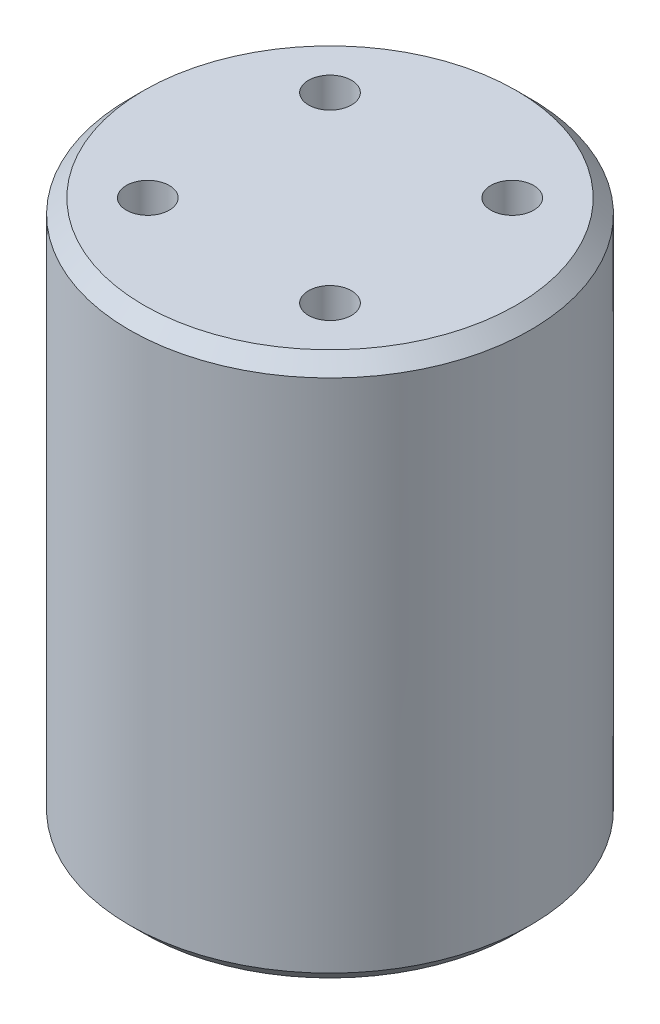
ISO-10303-21;
HEADER;
FILE_DESCRIPTION(('STEP AP214'),'2;1');
FILE_NAME('part.step','',(''),(''),'','','');
FILE_SCHEMA(('AUTOMOTIVE_DESIGN { 1 0 10303 214 1 1 1 1 }'));
ENDSEC;
DATA;
#1=APPLICATION_CONTEXT('core data for automotive mechanical design processes');
#2=APPLICATION_PROTOCOL_DEFINITION('international standard','automotive_design',2000,#1);
#3=PRODUCT_CONTEXT('',#1,'mechanical');
#4=PRODUCT('Part','Part','',(#3));
#5=PRODUCT_RELATED_PRODUCT_CATEGORY('part','',(#4));
#6=PRODUCT_DEFINITION_FORMATION('','',#4);
#7=PRODUCT_DEFINITION_CONTEXT('part definition',#1,'design');
#8=PRODUCT_DEFINITION('design','',#6,#7);
#9=PRODUCT_DEFINITION_SHAPE('','',#8);
#10=(LENGTH_UNIT() NAMED_UNIT(*) SI_UNIT(.MILLI.,.METRE.));
#11=(NAMED_UNIT(*) PLANE_ANGLE_UNIT() SI_UNIT($,.RADIAN.));
#12=(NAMED_UNIT(*) SI_UNIT($,.STERADIAN.) SOLID_ANGLE_UNIT());
#13=UNCERTAINTY_MEASURE_WITH_UNIT(LENGTH_MEASURE(1.E-05),#10,'distance_accuracy_value','');
#14=(GEOMETRIC_REPRESENTATION_CONTEXT(3) GLOBAL_UNCERTAINTY_ASSIGNED_CONTEXT((#13)) GLOBAL_UNIT_ASSIGNED_CONTEXT((#10,
#11,#12)) REPRESENTATION_CONTEXT('',''));
#15=CARTESIAN_POINT('',(0.,0.,0.));
#16=DIRECTION('',(0.,0.,1.));
#17=DIRECTION('',(1.,0.,0.));
#18=AXIS2_PLACEMENT_3D('',#15,#16,#17);
#19=CARTESIAN_POINT('',(0.,-10.,0.));
#20=DIRECTION('',(0.,1.,0.));
#21=DIRECTION('',(0.,0.,1.));
#22=AXIS2_PLACEMENT_3D('',#19,#20,#21);
#23=CYLINDRICAL_SURFACE('',#22,14.);
#24=CARTESIAN_POINT('',(0.,27.,0.));
#25=DIRECTION('',(0.,1.,0.));
#26=DIRECTION('',(0.,0.,1.));
#27=AXIS2_PLACEMENT_3D('',#24,#25,#26);
#28=CIRCLE('',#27,14.);
#29=CARTESIAN_POINT('',(0.,27.,14.));
#30=VERTEX_POINT('',#29);
#31=EDGE_CURVE('E260',#30,#30,#28,.F.);
#32=ORIENTED_EDGE('',*,*,#31,.T.);
#33=EDGE_LOOP('',(#32));
#34=FACE_BOUND('',#33,.T.);
#35=DIRECTION('',(0.,1.,0.));
#36=VECTOR('',#35,1.);
#37=CARTESIAN_POINT('',(-13.076696830622,-10.,5.));
#38=LINE('',#37,#36);
#39=CARTESIAN_POINT('',(-13.076696830622,-5.,5.));
#40=VERTEX_POINT('',#39);
#41=CARTESIAN_POINT('',(-13.076696830622,-9.,5.));
#42=VERTEX_POINT('',#41);
#43=EDGE_CURVE('E118',#40,#42,#38,.F.);
#44=ORIENTED_EDGE('',*,*,#43,.T.);
#45=CARTESIAN_POINT('',(0.,-9.,0.));
#46=DIRECTION('',(0.,1.,0.));
#47=DIRECTION('',(0.,0.,1.));
#48=AXIS2_PLACEMENT_3D('',#45,#46,#47);
#49=CIRCLE('',#48,14.);
#50=CARTESIAN_POINT('',(-13.076696830622,-9.,-5.));
#51=VERTEX_POINT('',#50);
#52=EDGE_CURVE('E256',#42,#51,#49,.T.);
#53=ORIENTED_EDGE('',*,*,#52,.T.);
#54=DIRECTION('',(0.,1.,0.));
#55=VECTOR('',#54,1.);
#56=CARTESIAN_POINT('',(-13.076696830622,-10.,-5.));
#57=LINE('',#56,#55);
#58=CARTESIAN_POINT('',(-13.076696830622,-5.,-5.));
#59=VERTEX_POINT('',#58);
#60=EDGE_CURVE('E172',#59,#51,#57,.F.);
#61=ORIENTED_EDGE('',*,*,#60,.F.);
#62=CARTESIAN_POINT('',(0.,-5.,0.));
#63=DIRECTION('',(0.,-1.,0.));
#64=DIRECTION('',(0.,0.,-1.));
#65=AXIS2_PLACEMENT_3D('',#62,#63,#64);
#66=CIRCLE('',#65,14.);
#67=EDGE_CURVE('E245',#59,#40,#66,.F.);
#68=ORIENTED_EDGE('',*,*,#67,.T.);
#69=EDGE_LOOP('',(#44,#53,#61,#68));
#70=FACE_BOUND('',#69,.T.);
#71=ADVANCED_FACE('F47',(#34,#70),#23,.T.);
#72=CARTESIAN_POINT('',(0.,-10.,0.));
#73=DIRECTION('',(0.,1.,0.));
#74=DIRECTION('',(0.,0.,1.));
#75=AXIS2_PLACEMENT_3D('',#72,#73,#74);
#76=PLANE('',#75);
#77=CARTESIAN_POINT('',(0.,-10.,0.));
#78=DIRECTION('',(0.,1.,0.));
#79=DIRECTION('',(0.,0.,1.));
#80=AXIS2_PLACEMENT_3D('',#77,#78,#79);
#81=CIRCLE('',#80,2.);
#82=CARTESIAN_POINT('',(0.,-10.,2.));
#83=VERTEX_POINT('',#82);
#84=EDGE_CURVE('E248',#83,#83,#81,.F.);
#85=ORIENTED_EDGE('',*,*,#84,.F.);
#86=EDGE_LOOP('',(#85));
#87=FACE_BOUND('',#86,.T.);
#88=CARTESIAN_POINT('',(6.36396103067896,-10.,6.36396103067925));
#89=DIRECTION('',(0.,-1.,0.));
#90=DIRECTION('',(0.,0.,-1.));
#91=AXIS2_PLACEMENT_3D('',#88,#89,#90);
#92=CIRCLE('',#91,1.50000000000037);
#93=CARTESIAN_POINT('',(6.36396103067896,-10.,4.86396103067888));
#94=VERTEX_POINT('',#93);
#95=EDGE_CURVE('E189',#94,#94,#92,.T.);
#96=ORIENTED_EDGE('',*,*,#95,.F.);
#97=EDGE_LOOP('',(#96));
#98=FACE_BOUND('',#97,.T.);
#99=CARTESIAN_POINT('',(-6.3639610306786,-10.,-6.36396103067889));
#100=DIRECTION('',(0.,-1.,0.));
#101=DIRECTION('',(0.,0.,-1.));
#102=AXIS2_PLACEMENT_3D('',#99,#100,#101);
#103=CIRCLE('',#102,1.50000000000019);
#104=CARTESIAN_POINT('',(-6.3639610306786,-10.,-7.86396103067908));
#105=VERTEX_POINT('',#104);
#106=EDGE_CURVE('E180',#105,#105,#103,.T.);
#107=ORIENTED_EDGE('',*,*,#106,.F.);
#108=EDGE_LOOP('',(#107));
#109=FACE_BOUND('',#108,.T.);
#110=CARTESIAN_POINT('',(6.36396103067925,-10.,-6.3639610306786));
#111=DIRECTION('',(0.,-1.,0.));
#112=DIRECTION('',(0.,0.,-1.));
#113=AXIS2_PLACEMENT_3D('',#110,#111,#112);
#114=CIRCLE('',#113,1.5000000000005);
#115=CARTESIAN_POINT('',(6.36396103067925,-10.,-7.86396103067911));
#116=VERTEX_POINT('',#115);
#117=EDGE_CURVE('E175',#116,#116,#114,.T.);
#118=ORIENTED_EDGE('',*,*,#117,.F.);
#119=EDGE_LOOP('',(#118));
#120=FACE_BOUND('',#119,.T.);
#121=CARTESIAN_POINT('',(-6.36396103067889,-10.,6.36396103067896));
#122=DIRECTION('',(0.,-1.,0.));
#123=DIRECTION('',(0.,0.,-1.));
#124=AXIS2_PLACEMENT_3D('',#121,#122,#123);
#125=CIRCLE('',#124,1.5);
#126=CARTESIAN_POINT('',(-6.36396103067889,-10.,4.86396103067896));
#127=VERTEX_POINT('',#126);
#128=EDGE_CURVE('E188',#127,#127,#125,.T.);
#129=ORIENTED_EDGE('',*,*,#128,.F.);
#130=EDGE_LOOP('',(#129));
#131=FACE_BOUND('',#130,.T.);
#132=DIRECTION('',(-1.,0.,0.));
#133=VECTOR('',#132,1.);
#134=CARTESIAN_POINT('',(0.,-10.,-5.));
#135=LINE('',#134,#133);
#136=CARTESIAN_POINT('',(-8.43376659056191,-10.,-5.));
#137=VERTEX_POINT('',#136);
#138=CARTESIAN_POINT('',(-12.,-10.,-5.));
#139=VERTEX_POINT('',#138);
#140=EDGE_CURVE('E242',#137,#139,#135,.T.);
#141=ORIENTED_EDGE('',*,*,#140,.T.);
#142=CARTESIAN_POINT('',(0.,-10.,0.));
#143=DIRECTION('',(0.,1.,0.));
#144=DIRECTION('',(0.,0.,1.));
#145=AXIS2_PLACEMENT_3D('',#142,#143,#144);
#146=CIRCLE('',#145,13.);
#147=CARTESIAN_POINT('',(-12.,-10.,5.));
#148=VERTEX_POINT('',#147);
#149=EDGE_CURVE('E63',#139,#148,#146,.F.);
#150=ORIENTED_EDGE('',*,*,#149,.T.);
#151=DIRECTION('',(-1.,0.,0.));
#152=VECTOR('',#151,1.);
#153=CARTESIAN_POINT('',(0.,-10.,5.));
#154=LINE('',#153,#152);
#155=CARTESIAN_POINT('',(-8.43376659056191,-10.,5.));
#156=VERTEX_POINT('',#155);
#157=EDGE_CURVE('E236',#156,#148,#154,.T.);
#158=ORIENTED_EDGE('',*,*,#157,.F.);
#159=CARTESIAN_POINT('',(-8.43376659056191,-10.,4.));
#160=DIRECTION('',(0.,-1.,0.));
#161=DIRECTION('',(0.,0.,-1.));
#162=AXIS2_PLACEMENT_3D('',#159,#160,#161);
#163=CIRCLE('',#162,1.);
#164=CARTESIAN_POINT('',(-7.43376659056191,-10.,4.));
#165=VERTEX_POINT('',#164);
#166=EDGE_CURVE('E132',#156,#165,#163,.F.);
#167=ORIENTED_EDGE('',*,*,#166,.T.);
#168=DIRECTION('',(0.,0.,-1.));
#169=VECTOR('',#168,1.);
#170=CARTESIAN_POINT('',(-7.43376659056191,-10.,0.));
#171=LINE('',#170,#169);
#172=CARTESIAN_POINT('',(-7.43376659056191,-10.,-4.));
#173=VERTEX_POINT('',#172);
#174=EDGE_CURVE('E140',#165,#173,#171,.T.);
#175=ORIENTED_EDGE('',*,*,#174,.T.);
#176=CARTESIAN_POINT('',(-8.43376659056191,-10.,-4.));
#177=DIRECTION('',(0.,-1.,0.));
#178=DIRECTION('',(0.,0.,-1.));
#179=AXIS2_PLACEMENT_3D('',#176,#177,#178);
#180=CIRCLE('',#179,1.);
#181=EDGE_CURVE('E144',#137,#173,#180,.T.);
#182=ORIENTED_EDGE('',*,*,#181,.F.);
#183=EDGE_LOOP('',(#141,#150,#158,#167,#175,#182));
#184=FACE_BOUND('',#183,.T.);
#185=ADVANCED_FACE('F349',(#87,#98,#109,#120,#131,#184),#76,.F.);
#186=CARTESIAN_POINT('',(0.,28.,0.));
#187=DIRECTION('',(0.,1.,0.));
#188=DIRECTION('',(0.,0.,1.));
#189=AXIS2_PLACEMENT_3D('',#186,#187,#188);
#190=PLANE('',#189);
#191=CARTESIAN_POINT('',(0.,28.,0.));
#192=DIRECTION('',(0.,1.,0.));
#193=DIRECTION('',(0.,0.,1.));
#194=AXIS2_PLACEMENT_3D('',#191,#192,#193);
#195=CIRCLE('',#194,13.);
#196=CARTESIAN_POINT('',(0.,28.,13.));
#197=VERTEX_POINT('',#196);
#198=EDGE_CURVE('E252',#197,#197,#195,.T.);
#199=ORIENTED_EDGE('',*,*,#198,.T.);
#200=EDGE_LOOP('',(#199));
#201=FACE_BOUND('',#200,.T.);
#202=CARTESIAN_POINT('',(-6.36396103067856,28.,6.36396103067894));
#203=DIRECTION('',(0.,1.,0.));
#204=DIRECTION('',(0.,0.,1.));
#205=AXIS2_PLACEMENT_3D('',#202,#203,#204);
#206=CIRCLE('',#205,1.50000000000041);
#207=CARTESIAN_POINT('',(-6.36396103067856,28.,7.86396103067934));
#208=VERTEX_POINT('',#207);
#209=EDGE_CURVE('E225',#208,#208,#206,.T.);
#210=ORIENTED_EDGE('',*,*,#209,.F.);
#211=EDGE_LOOP('',(#210));
#212=FACE_BOUND('',#211,.T.);
#213=CARTESIAN_POINT('',(6.3639610306793,28.,6.36396103067856));
#214=DIRECTION('',(0.,1.,0.));
#215=DIRECTION('',(0.,0.,1.));
#216=AXIS2_PLACEMENT_3D('',#213,#214,#215);
#217=CIRCLE('',#216,1.50000000000055);
#218=CARTESIAN_POINT('',(6.3639610306793,28.,7.8639610306791));
#219=VERTEX_POINT('',#218);
#220=EDGE_CURVE('E217',#219,#219,#217,.T.);
#221=ORIENTED_EDGE('',*,*,#220,.F.);
#222=EDGE_LOOP('',(#221));
#223=FACE_BOUND('',#222,.T.);
#224=CARTESIAN_POINT('',(6.36396103067892,28.,-6.3639610306793));
#225=DIRECTION('',(0.,1.,0.));
#226=DIRECTION('',(0.,0.,1.));
#227=AXIS2_PLACEMENT_3D('',#224,#225,#226);
#228=CIRCLE('',#227,1.5000000000002);
#229=CARTESIAN_POINT('',(6.36396103067892,28.,-4.8639610306791));
#230=VERTEX_POINT('',#229);
#231=EDGE_CURVE('E208',#230,#230,#228,.T.);
#232=ORIENTED_EDGE('',*,*,#231,.F.);
#233=EDGE_LOOP('',(#232));
#234=FACE_BOUND('',#233,.T.);
#235=CARTESIAN_POINT('',(-6.36396103067894,28.,-6.36396103067892));
#236=DIRECTION('',(0.,1.,0.));
#237=DIRECTION('',(0.,0.,1.));
#238=AXIS2_PLACEMENT_3D('',#235,#236,#237);
#239=CIRCLE('',#238,1.5);
#240=CARTESIAN_POINT('',(-6.36396103067894,28.,-4.86396103067892));
#241=VERTEX_POINT('',#240);
#242=EDGE_CURVE('E212',#241,#241,#239,.T.);
#243=ORIENTED_EDGE('',*,*,#242,.F.);
#244=EDGE_LOOP('',(#243));
#245=FACE_BOUND('',#244,.T.);
#246=ADVANCED_FACE('F345',(#201,#212,#223,#234,#245),#190,.T.);
#247=CARTESIAN_POINT('',(-6.36396103067894,20.,-6.36396103067892));
#248=DIRECTION('',(0.,1.,0.));
#249=DIRECTION('',(0.,0.,1.));
#250=AXIS2_PLACEMENT_3D('',#247,#248,#249);
#251=CYLINDRICAL_SURFACE('',#250,1.5);
#252=CARTESIAN_POINT('',(-6.36396103067894,20.,-6.36396103067892));
#253=DIRECTION('',(0.,1.,0.));
#254=DIRECTION('',(0.,0.,1.));
#255=AXIS2_PLACEMENT_3D('',#252,#253,#254);
#256=CIRCLE('',#255,1.5);
#257=CARTESIAN_POINT('',(-6.36396103067894,20.,-4.86396103067892));
#258=VERTEX_POINT('',#257);
#259=EDGE_CURVE('E232',#258,#258,#256,.T.);
#260=ORIENTED_EDGE('',*,*,#259,.F.);
#261=EDGE_LOOP('',(#260));
#262=FACE_BOUND('',#261,.T.);
#263=ORIENTED_EDGE('',*,*,#242,.T.);
#264=EDGE_LOOP('',(#263));
#265=FACE_BOUND('',#264,.T.);
#266=ADVANCED_FACE('F341',(#262,#265),#251,.F.);
#267=CARTESIAN_POINT('',(-6.36396103067894,20.,-6.36396103067892));
#268=DIRECTION('',(0.,1.,0.));
#269=DIRECTION('',(0.,0.,1.));
#270=AXIS2_PLACEMENT_3D('',#267,#268,#269);
#271=PLANE('',#270);
#272=ORIENTED_EDGE('',*,*,#259,.T.);
#273=EDGE_LOOP('',(#272));
#274=FACE_BOUND('',#273,.T.);
#275=ADVANCED_FACE('F319',(#274),#271,.T.);
#276=CARTESIAN_POINT('',(6.36396103067892,20.,-6.3639610306793));
#277=DIRECTION('',(0.,1.,0.));
#278=DIRECTION('',(0.,0.,1.));
#279=AXIS2_PLACEMENT_3D('',#276,#277,#278);
#280=CYLINDRICAL_SURFACE('',#279,1.5000000000002);
#281=CARTESIAN_POINT('',(6.36396103067892,20.,-6.3639610306793));
#282=DIRECTION('',(0.,1.,0.));
#283=DIRECTION('',(0.,0.,1.));
#284=AXIS2_PLACEMENT_3D('',#281,#282,#283);
#285=CIRCLE('',#284,1.5000000000002);
#286=CARTESIAN_POINT('',(6.36396103067892,20.,-4.8639610306791));
#287=VERTEX_POINT('',#286);
#288=EDGE_CURVE('E213',#287,#287,#285,.T.);
#289=ORIENTED_EDGE('',*,*,#288,.F.);
#290=EDGE_LOOP('',(#289));
#291=FACE_BOUND('',#290,.T.);
#292=ORIENTED_EDGE('',*,*,#231,.T.);
#293=EDGE_LOOP('',(#292));
#294=FACE_BOUND('',#293,.T.);
#295=ADVANCED_FACE('F315',(#291,#294),#280,.F.);
#296=CARTESIAN_POINT('',(6.36396103067892,20.,-6.3639610306793));
#297=DIRECTION('',(0.,1.,0.));
#298=DIRECTION('',(0.,0.,1.));
#299=AXIS2_PLACEMENT_3D('',#296,#297,#298);
#300=PLANE('',#299);
#301=ORIENTED_EDGE('',*,*,#288,.T.);
#302=EDGE_LOOP('',(#301));
#303=FACE_BOUND('',#302,.T.);
#304=ADVANCED_FACE('F318',(#303),#300,.T.);
#305=CARTESIAN_POINT('',(6.3639610306793,20.,6.36396103067856));
#306=DIRECTION('',(0.,1.,0.));
#307=DIRECTION('',(0.,0.,1.));
#308=AXIS2_PLACEMENT_3D('',#305,#306,#307);
#309=CYLINDRICAL_SURFACE('',#308,1.50000000000055);
#310=CARTESIAN_POINT('',(6.3639610306793,20.,6.36396103067856));
#311=DIRECTION('',(0.,1.,0.));
#312=DIRECTION('',(0.,0.,1.));
#313=AXIS2_PLACEMENT_3D('',#310,#311,#312);
#314=CIRCLE('',#313,1.50000000000055);
#315=CARTESIAN_POINT('',(6.3639610306793,20.,7.8639610306791));
#316=VERTEX_POINT('',#315);
#317=EDGE_CURVE('E221',#316,#316,#314,.T.);
#318=ORIENTED_EDGE('',*,*,#317,.F.);
#319=EDGE_LOOP('',(#318));
#320=FACE_BOUND('',#319,.T.);
#321=ORIENTED_EDGE('',*,*,#220,.T.);
#322=EDGE_LOOP('',(#321));
#323=FACE_BOUND('',#322,.T.);
#324=ADVANCED_FACE('F323',(#320,#323),#309,.F.);
#325=CARTESIAN_POINT('',(6.3639610306793,20.,6.36396103067856));
#326=DIRECTION('',(0.,1.,0.));
#327=DIRECTION('',(0.,0.,1.));
#328=AXIS2_PLACEMENT_3D('',#325,#326,#327);
#329=PLANE('',#328);
#330=ORIENTED_EDGE('',*,*,#317,.T.);
#331=EDGE_LOOP('',(#330));
#332=FACE_BOUND('',#331,.T.);
#333=ADVANCED_FACE('F327',(#332),#329,.T.);
#334=CARTESIAN_POINT('',(-6.36396103067856,20.,6.36396103067894));
#335=DIRECTION('',(0.,1.,0.));
#336=DIRECTION('',(0.,0.,1.));
#337=AXIS2_PLACEMENT_3D('',#334,#335,#336);
#338=CYLINDRICAL_SURFACE('',#337,1.50000000000041);
#339=CARTESIAN_POINT('',(-6.36396103067856,20.,6.36396103067894));
#340=DIRECTION('',(0.,1.,0.));
#341=DIRECTION('',(0.,0.,1.));
#342=AXIS2_PLACEMENT_3D('',#339,#340,#341);
#343=CIRCLE('',#342,1.50000000000041);
#344=CARTESIAN_POINT('',(-6.36396103067856,20.,7.86396103067934));
#345=VERTEX_POINT('',#344);
#346=EDGE_CURVE('E204',#345,#345,#343,.T.);
#347=ORIENTED_EDGE('',*,*,#346,.F.);
#348=EDGE_LOOP('',(#347));
#349=FACE_BOUND('',#348,.T.);
#350=ORIENTED_EDGE('',*,*,#209,.T.);
#351=EDGE_LOOP('',(#350));
#352=FACE_BOUND('',#351,.T.);
#353=ADVANCED_FACE('F331',(#349,#352),#338,.F.);
#354=CARTESIAN_POINT('',(-6.36396103067856,20.,6.36396103067894));
#355=DIRECTION('',(0.,1.,0.));
#356=DIRECTION('',(0.,0.,1.));
#357=AXIS2_PLACEMENT_3D('',#354,#355,#356);
#358=PLANE('',#357);
#359=ORIENTED_EDGE('',*,*,#346,.T.);
#360=EDGE_LOOP('',(#359));
#361=FACE_BOUND('',#360,.T.);
#362=ADVANCED_FACE('F313',(#361),#358,.T.);
#363=CARTESIAN_POINT('',(-6.36396103067889,-6.,6.36396103067896));
#364=DIRECTION('',(0.,-1.,0.));
#365=DIRECTION('',(0.,0.,-1.));
#366=AXIS2_PLACEMENT_3D('',#363,#364,#365);
#367=CYLINDRICAL_SURFACE('',#366,1.5);
#368=CARTESIAN_POINT('',(-6.36396103067889,-6.,6.36396103067896));
#369=DIRECTION('',(0.,-1.,0.));
#370=DIRECTION('',(0.,0.,-1.));
#371=AXIS2_PLACEMENT_3D('',#368,#369,#370);
#372=CIRCLE('',#371,1.5);
#373=CARTESIAN_POINT('',(-6.36396103067889,-6.,4.86396103067896));
#374=VERTEX_POINT('',#373);
#375=EDGE_CURVE('E200',#374,#374,#372,.T.);
#376=ORIENTED_EDGE('',*,*,#375,.F.);
#377=EDGE_LOOP('',(#376));
#378=FACE_BOUND('',#377,.T.);
#379=ORIENTED_EDGE('',*,*,#128,.T.);
#380=EDGE_LOOP('',(#379));
#381=FACE_BOUND('',#380,.T.);
#382=ADVANCED_FACE('F309',(#378,#381),#367,.F.);
#383=CARTESIAN_POINT('',(0.,-6.,0.));
#384=DIRECTION('',(0.,-1.,0.));
#385=DIRECTION('',(0.,0.,-1.));
#386=AXIS2_PLACEMENT_3D('',#383,#384,#385);
#387=PLANE('',#386);
#388=ORIENTED_EDGE('',*,*,#375,.T.);
#389=EDGE_LOOP('',(#388));
#390=FACE_BOUND('',#389,.T.);
#391=ADVANCED_FACE('F291',(#390),#387,.T.);
#392=CARTESIAN_POINT('',(6.36396103067925,-6.,-6.3639610306786));
#393=DIRECTION('',(0.,-1.,0.));
#394=DIRECTION('',(0.,0.,-1.));
#395=AXIS2_PLACEMENT_3D('',#392,#393,#394);
#396=CYLINDRICAL_SURFACE('',#395,1.5000000000005);
#397=CARTESIAN_POINT('',(6.36396103067925,-6.,-6.3639610306786));
#398=DIRECTION('',(0.,-1.,0.));
#399=DIRECTION('',(0.,0.,-1.));
#400=AXIS2_PLACEMENT_3D('',#397,#398,#399);
#401=CIRCLE('',#400,1.5000000000005);
#402=CARTESIAN_POINT('',(6.36396103067925,-6.,-7.86396103067911));
#403=VERTEX_POINT('',#402);
#404=EDGE_CURVE('E176',#403,#403,#401,.T.);
#405=ORIENTED_EDGE('',*,*,#404,.F.);
#406=EDGE_LOOP('',(#405));
#407=FACE_BOUND('',#406,.T.);
#408=ORIENTED_EDGE('',*,*,#117,.T.);
#409=EDGE_LOOP('',(#408));
#410=FACE_BOUND('',#409,.T.);
#411=ADVANCED_FACE('F287',(#407,#410),#396,.F.);
#412=CARTESIAN_POINT('',(0.,-6.,0.));
#413=DIRECTION('',(0.,-1.,0.));
#414=DIRECTION('',(0.,0.,-1.));
#415=AXIS2_PLACEMENT_3D('',#412,#413,#414);
#416=PLANE('',#415);
#417=ORIENTED_EDGE('',*,*,#404,.T.);
#418=EDGE_LOOP('',(#417));
#419=FACE_BOUND('',#418,.T.);
#420=ADVANCED_FACE('F283',(#419),#416,.T.);
#421=CARTESIAN_POINT('',(-6.3639610306786,-6.,-6.36396103067889));
#422=DIRECTION('',(0.,-1.,0.));
#423=DIRECTION('',(0.,0.,-1.));
#424=AXIS2_PLACEMENT_3D('',#421,#422,#423);
#425=CYLINDRICAL_SURFACE('',#424,1.50000000000019);
#426=CARTESIAN_POINT('',(-6.3639610306786,-6.,-6.36396103067889));
#427=DIRECTION('',(0.,-1.,0.));
#428=DIRECTION('',(0.,0.,-1.));
#429=AXIS2_PLACEMENT_3D('',#426,#427,#428);
#430=CIRCLE('',#429,1.50000000000019);
#431=CARTESIAN_POINT('',(-6.3639610306786,-6.,-7.86396103067908));
#432=VERTEX_POINT('',#431);
#433=EDGE_CURVE('E193',#432,#432,#430,.T.);
#434=ORIENTED_EDGE('',*,*,#433,.F.);
#435=EDGE_LOOP('',(#434));
#436=FACE_BOUND('',#435,.T.);
#437=ORIENTED_EDGE('',*,*,#106,.T.);
#438=EDGE_LOOP('',(#437));
#439=FACE_BOUND('',#438,.T.);
#440=ADVANCED_FACE('F286',(#436,#439),#425,.F.);
#441=CARTESIAN_POINT('',(0.,-6.,0.));
#442=DIRECTION('',(0.,-1.,0.));
#443=DIRECTION('',(0.,0.,-1.));
#444=AXIS2_PLACEMENT_3D('',#441,#442,#443);
#445=PLANE('',#444);
#446=ORIENTED_EDGE('',*,*,#433,.T.);
#447=EDGE_LOOP('',(#446));
#448=FACE_BOUND('',#447,.T.);
#449=ADVANCED_FACE('F299',(#448),#445,.T.);
#450=CARTESIAN_POINT('',(6.36396103067896,-6.,6.36396103067925));
#451=DIRECTION('',(0.,-1.,0.));
#452=DIRECTION('',(0.,0.,-1.));
#453=AXIS2_PLACEMENT_3D('',#450,#451,#452);
#454=CYLINDRICAL_SURFACE('',#453,1.50000000000037);
#455=CARTESIAN_POINT('',(6.36396103067896,-6.,6.36396103067925));
#456=DIRECTION('',(0.,-1.,0.));
#457=DIRECTION('',(0.,0.,-1.));
#458=AXIS2_PLACEMENT_3D('',#455,#456,#457);
#459=CIRCLE('',#458,1.50000000000037);
#460=CARTESIAN_POINT('',(6.36396103067896,-6.,4.86396103067888));
#461=VERTEX_POINT('',#460);
#462=EDGE_CURVE('E184',#461,#461,#459,.T.);
#463=ORIENTED_EDGE('',*,*,#462,.F.);
#464=EDGE_LOOP('',(#463));
#465=FACE_BOUND('',#464,.T.);
#466=ORIENTED_EDGE('',*,*,#95,.T.);
#467=EDGE_LOOP('',(#466));
#468=FACE_BOUND('',#467,.T.);
#469=ADVANCED_FACE('F295',(#465,#468),#454,.F.);
#470=CARTESIAN_POINT('',(0.,-6.,0.));
#471=DIRECTION('',(0.,-1.,0.));
#472=DIRECTION('',(0.,0.,-1.));
#473=AXIS2_PLACEMENT_3D('',#470,#471,#472);
#474=PLANE('',#473);
#475=ORIENTED_EDGE('',*,*,#462,.T.);
#476=EDGE_LOOP('',(#475));
#477=FACE_BOUND('',#476,.T.);
#478=ADVANCED_FACE('F282',(#477),#474,.T.);
#479=CARTESIAN_POINT('',(-8.43376659056191,-5.,4.));
#480=DIRECTION('',(0.,-1.,0.));
#481=DIRECTION('',(0.,0.,-1.));
#482=AXIS2_PLACEMENT_3D('',#479,#480,#481);
#483=CYLINDRICAL_SURFACE('',#482,1.);
#484=ORIENTED_EDGE('',*,*,#166,.F.);
#485=DIRECTION('',(0.,-1.,0.));
#486=VECTOR('',#485,1.);
#487=CARTESIAN_POINT('',(-8.43376659056191,-5.,5.));
#488=LINE('',#487,#486);
#489=CARTESIAN_POINT('',(-8.43376659056191,-5.,5.));
#490=VERTEX_POINT('',#489);
#491=EDGE_CURVE('E116',#490,#156,#488,.T.);
#492=ORIENTED_EDGE('',*,*,#491,.F.);
#493=CARTESIAN_POINT('',(-8.43376659056191,-5.,4.));
#494=DIRECTION('',(0.,-1.,0.));
#495=DIRECTION('',(0.,0.,-1.));
#496=AXIS2_PLACEMENT_3D('',#493,#494,#495);
#497=CIRCLE('',#496,1.);
#498=CARTESIAN_POINT('',(-7.43376659056191,-5.,4.));
#499=VERTEX_POINT('',#498);
#500=EDGE_CURVE('E124',#490,#499,#497,.F.);
#501=ORIENTED_EDGE('',*,*,#500,.T.);
#502=DIRECTION('',(0.,-1.,0.));
#503=VECTOR('',#502,1.);
#504=CARTESIAN_POINT('',(-7.43376659056191,-5.,4.));
#505=LINE('',#504,#503);
#506=EDGE_CURVE('E161',#499,#165,#505,.T.);
#507=ORIENTED_EDGE('',*,*,#506,.T.);
#508=EDGE_LOOP('',(#484,#492,#501,#507));
#509=FACE_BOUND('',#508,.T.);
#510=ADVANCED_FACE('F128',(#509),#483,.F.);
#511=CARTESIAN_POINT('',(-7.43376659056191,-5.,0.));
#512=DIRECTION('',(-1.,0.,0.));
#513=DIRECTION('',(0.,0.,1.));
#514=AXIS2_PLACEMENT_3D('',#511,#512,#513);
#515=PLANE('',#514);
#516=ORIENTED_EDGE('',*,*,#174,.F.);
#517=ORIENTED_EDGE('',*,*,#506,.F.);
#518=DIRECTION('',(0.,0.,-1.));
#519=VECTOR('',#518,1.);
#520=CARTESIAN_POINT('',(-7.43376659056191,-5.,0.));
#521=LINE('',#520,#519);
#522=CARTESIAN_POINT('',(-7.43376659056191,-5.,-4.));
#523=VERTEX_POINT('',#522);
#524=EDGE_CURVE('E135',#499,#523,#521,.T.);
#525=ORIENTED_EDGE('',*,*,#524,.T.);
#526=DIRECTION('',(0.,-1.,0.));
#527=VECTOR('',#526,1.);
#528=CARTESIAN_POINT('',(-7.43376659056191,-5.,-4.));
#529=LINE('',#528,#527);
#530=EDGE_CURVE('E164',#523,#173,#529,.T.);
#531=ORIENTED_EDGE('',*,*,#530,.T.);
#532=EDGE_LOOP('',(#516,#517,#525,#531));
#533=FACE_BOUND('',#532,.T.);
#534=ADVANCED_FACE('F281',(#533),#515,.T.);
#535=CARTESIAN_POINT('',(-8.43376659056191,-5.,-4.));
#536=DIRECTION('',(0.,-1.,0.));
#537=DIRECTION('',(0.,0.,-1.));
#538=AXIS2_PLACEMENT_3D('',#535,#536,#537);
#539=CYLINDRICAL_SURFACE('',#538,1.);
#540=ORIENTED_EDGE('',*,*,#181,.T.);
#541=ORIENTED_EDGE('',*,*,#530,.F.);
#542=CARTESIAN_POINT('',(-8.43376659056191,-5.,-4.));
#543=DIRECTION('',(0.,-1.,0.));
#544=DIRECTION('',(0.,0.,-1.));
#545=AXIS2_PLACEMENT_3D('',#542,#543,#544);
#546=CIRCLE('',#545,1.);
#547=CARTESIAN_POINT('',(-8.43376659056191,-5.,-5.));
#548=VERTEX_POINT('',#547);
#549=EDGE_CURVE('E151',#548,#523,#546,.T.);
#550=ORIENTED_EDGE('',*,*,#549,.F.);
#551=DIRECTION('',(0.,-1.,0.));
#552=VECTOR('',#551,1.);
#553=CARTESIAN_POINT('',(-8.43376659056191,-5.,-5.));
#554=LINE('',#553,#552);
#555=EDGE_CURVE('E134',#548,#137,#554,.T.);
#556=ORIENTED_EDGE('',*,*,#555,.T.);
#557=EDGE_LOOP('',(#540,#541,#550,#556));
#558=FACE_BOUND('',#557,.T.);
#559=ADVANCED_FACE('F274',(#558),#539,.F.);
#560=CARTESIAN_POINT('',(0.,-5.,-5.));
#561=DIRECTION('',(0.,0.,-1.));
#562=DIRECTION('',(-1.,0.,0.));
#563=AXIS2_PLACEMENT_3D('',#560,#561,#562);
#564=PLANE('',#563);
#565=ORIENTED_EDGE('',*,*,#60,.T.);
#566=CARTESIAN_POINT('',(-13.076696830622,-9.,-5.));
#567=CARTESIAN_POINT('',(-12.8977376278225,-9.16719450887815,-5.));
#568=CARTESIAN_POINT('',(-12.7185332977464,-9.33412508999459,-5.));
#569=CARTESIAN_POINT('',(-12.3596343542843,-9.66745842341252,-5.));
#570=CARTESIAN_POINT('',(-12.1799397408197,-9.8338611756294,-5.));
#571=CARTESIAN_POINT('',(-12.,-10.,-5.));
#572=B_SPLINE_CURVE_WITH_KNOTS('',3,(#566,#567,#568,#569,#570,#571),.UNSPECIFIED.,.F.,.F.,(4,2,
4),(0.,0.734724504470219,1.46944912668042),.UNSPECIFIED.);
#573=EDGE_CURVE('E77',#51,#139,#572,.T.);
#574=ORIENTED_EDGE('',*,*,#573,.T.);
#575=ORIENTED_EDGE('',*,*,#140,.F.);
#576=ORIENTED_EDGE('',*,*,#555,.F.);
#577=DIRECTION('',(1.,0.,0.));
#578=VECTOR('',#577,1.);
#579=CARTESIAN_POINT('',(0.,-5.,-5.));
#580=LINE('',#579,#578);
#581=EDGE_CURVE('E123',#59,#548,#580,.T.);
#582=ORIENTED_EDGE('',*,*,#581,.F.);
#583=EDGE_LOOP('',(#565,#574,#575,#576,#582));
#584=FACE_BOUND('',#583,.T.);
#585=ADVANCED_FACE('F270',(#584),#564,.F.);
#586=CARTESIAN_POINT('',(0.,-5.,5.));
#587=DIRECTION('',(0.,0.,-1.));
#588=DIRECTION('',(-1.,0.,0.));
#589=AXIS2_PLACEMENT_3D('',#586,#587,#588);
#590=PLANE('',#589);
#591=ORIENTED_EDGE('',*,*,#157,.T.);
#592=CARTESIAN_POINT('',(-12.,-10.,5.));
#593=CARTESIAN_POINT('',(-12.1799397408197,-9.8338611756294,5.));
#594=CARTESIAN_POINT('',(-12.3596343542843,-9.66745842341252,5.));
#595=CARTESIAN_POINT('',(-12.7185332977464,-9.33412508999459,5.));
#596=CARTESIAN_POINT('',(-12.8977376278225,-9.16719450887815,5.));
#597=CARTESIAN_POINT('',(-13.076696830622,-9.,5.));
#598=B_SPLINE_CURVE_WITH_KNOTS('',3,(#592,#593,#594,#595,#596,#597),.UNSPECIFIED.,.F.,.F.,(4,2,
4),(0.,0.734724622210203,1.46944912668042),.UNSPECIFIED.);
#599=EDGE_CURVE('E11',#148,#42,#598,.T.);
#600=ORIENTED_EDGE('',*,*,#599,.T.);
#601=ORIENTED_EDGE('',*,*,#43,.F.);
#602=DIRECTION('',(1.,0.,0.));
#603=VECTOR('',#602,1.);
#604=CARTESIAN_POINT('',(0.,-5.,5.));
#605=LINE('',#604,#603);
#606=EDGE_CURVE('E113',#40,#490,#605,.T.);
#607=ORIENTED_EDGE('',*,*,#606,.T.);
#608=ORIENTED_EDGE('',*,*,#491,.T.);
#609=EDGE_LOOP('',(#591,#600,#601,#607,#608));
#610=FACE_BOUND('',#609,.T.);
#611=ADVANCED_FACE('F115',(#610),#590,.T.);
#612=CARTESIAN_POINT('',(0.,-5.,0.));
#613=DIRECTION('',(0.,-1.,0.));
#614=DIRECTION('',(0.,0.,-1.));
#615=AXIS2_PLACEMENT_3D('',#612,#613,#614);
#616=PLANE('',#615);
#617=ORIENTED_EDGE('',*,*,#581,.T.);
#618=ORIENTED_EDGE('',*,*,#549,.T.);
#619=ORIENTED_EDGE('',*,*,#524,.F.);
#620=ORIENTED_EDGE('',*,*,#500,.F.);
#621=ORIENTED_EDGE('',*,*,#606,.F.);
#622=ORIENTED_EDGE('',*,*,#67,.F.);
#623=EDGE_LOOP('',(#617,#618,#619,#620,#621,#622));
#624=FACE_BOUND('',#623,.T.);
#625=ADVANCED_FACE('F137',(#624),#616,.T.);
#626=CARTESIAN_POINT('',(0.,-11.,0.));
#627=DIRECTION('',(0.,1.,0.));
#628=DIRECTION('',(0.,0.,1.));
#629=AXIS2_PLACEMENT_3D('',#626,#627,#628);
#630=CYLINDRICAL_SURFACE('',#629,2.);
#631=CARTESIAN_POINT('',(0.,-11.,0.));
#632=DIRECTION('',(0.,-1.,0.));
#633=DIRECTION('',(0.,0.,-1.));
#634=AXIS2_PLACEMENT_3D('',#631,#632,#633);
#635=CIRCLE('',#634,2.);
#636=CARTESIAN_POINT('',(0.,-11.,-2.));
#637=VERTEX_POINT('',#636);
#638=EDGE_CURVE('E147',#637,#637,#635,.T.);
#639=ORIENTED_EDGE('',*,*,#638,.F.);
#640=EDGE_LOOP('',(#639));
#641=FACE_BOUND('',#640,.T.);
#642=ORIENTED_EDGE('',*,*,#84,.T.);
#643=EDGE_LOOP('',(#642));
#644=FACE_BOUND('',#643,.T.);
#645=ADVANCED_FACE('F368',(#641,#644),#630,.T.);
#646=CARTESIAN_POINT('',(0.,-11.,0.));
#647=DIRECTION('',(0.,-1.,0.));
#648=DIRECTION('',(0.,0.,-1.));
#649=AXIS2_PLACEMENT_3D('',#646,#647,#648);
#650=PLANE('',#649);
#651=ORIENTED_EDGE('',*,*,#638,.T.);
#652=EDGE_LOOP('',(#651));
#653=FACE_BOUND('',#652,.T.);
#654=ADVANCED_FACE('F361',(#653),#650,.T.);
#655=CARTESIAN_POINT('',(0.,28.,0.));
#656=DIRECTION('',(0.,-1.,0.));
#657=DIRECTION('',(0.,0.,-1.));
#658=AXIS2_PLACEMENT_3D('',#655,#656,#657);
#659=CONICAL_SURFACE('',#658,13.,0.785398163397446);
#660=ORIENTED_EDGE('',*,*,#31,.F.);
#661=EDGE_LOOP('',(#660));
#662=FACE_BOUND('',#661,.T.);
#663=ORIENTED_EDGE('',*,*,#198,.F.);
#664=EDGE_LOOP('',(#663));
#665=FACE_BOUND('',#664,.T.);
#666=ADVANCED_FACE('F357',(#662,#665),#659,.T.);
#667=CARTESIAN_POINT('',(0.,-9.,0.));
#668=DIRECTION('',(0.,1.,0.));
#669=DIRECTION('',(0.,0.,1.));
#670=AXIS2_PLACEMENT_3D('',#667,#668,#669);
#671=CONICAL_SURFACE('',#670,14.,0.785398163397452);
#672=ORIENTED_EDGE('',*,*,#599,.F.);
#673=ORIENTED_EDGE('',*,*,#149,.F.);
#674=ORIENTED_EDGE('',*,*,#573,.F.);
#675=ORIENTED_EDGE('',*,*,#52,.F.);
#676=EDGE_LOOP('',(#672,#673,#674,#675));
#677=FACE_BOUND('',#676,.T.);
#678=ADVANCED_FACE('F50',(#677),#671,.T.);
#679=CLOSED_SHELL('',(#71,#185,#246,#266,#275,#295,#304,#324,#333,#353,#362,#382,#391,#411,#420,
#440,#449,#469,#478,#510,#534,#559,#585,#611,#625,#645,#654,#666,#678));
#680=MANIFOLD_SOLID_BREP('B2',#679);
#681=ADVANCED_BREP_SHAPE_REPRESENTATION('',(#18,#680),#14);
#682=SHAPE_DEFINITION_REPRESENTATION(#9,#681);
ENDSEC;
END-ISO-10303-21;
